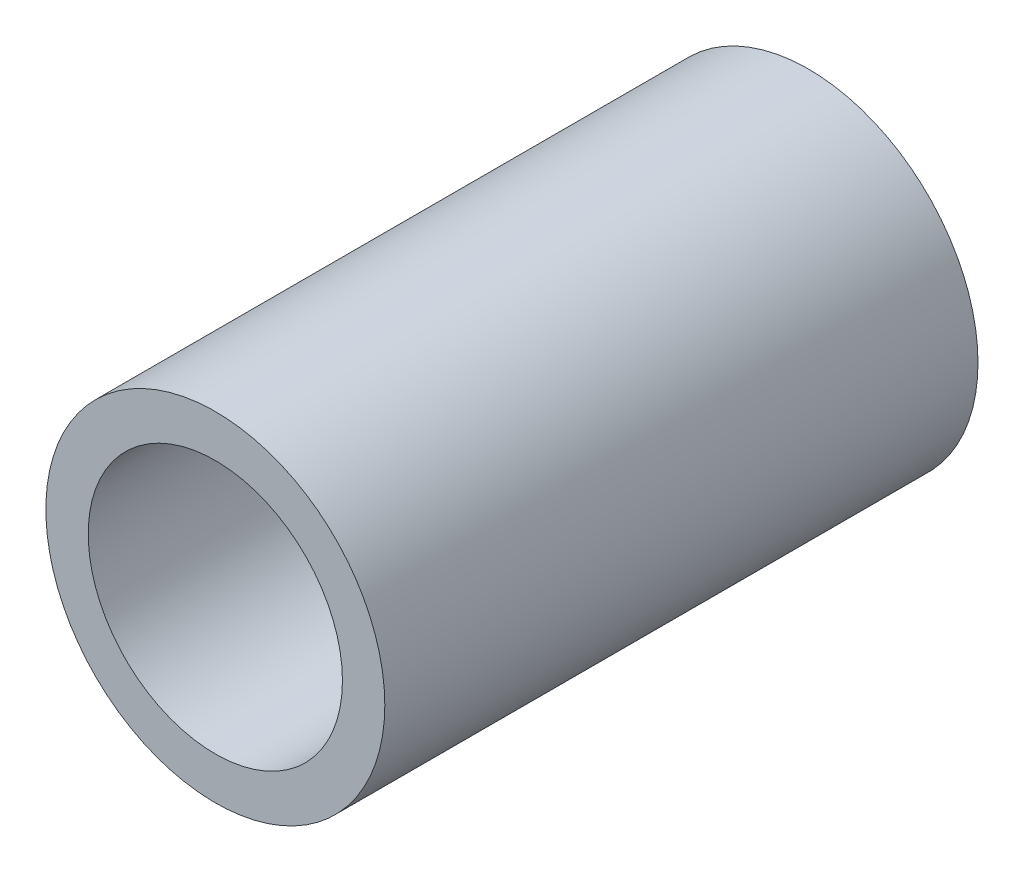
ISO-10303-21;
HEADER;
FILE_DESCRIPTION(('STEP AP214'),'2;1');
FILE_NAME('part.step','',(''),(''),'','','');
FILE_SCHEMA(('AUTOMOTIVE_DESIGN { 1 0 10303 214 1 1 1 1 }'));
ENDSEC;
DATA;
#1=APPLICATION_CONTEXT('core data for automotive mechanical design processes');
#2=APPLICATION_PROTOCOL_DEFINITION('international standard','automotive_design',2000,#1);
#3=PRODUCT_CONTEXT('',#1,'mechanical');
#4=PRODUCT('Part','Part','',(#3));
#5=PRODUCT_RELATED_PRODUCT_CATEGORY('part','',(#4));
#6=PRODUCT_DEFINITION_FORMATION('','',#4);
#7=PRODUCT_DEFINITION_CONTEXT('part definition',#1,'design');
#8=PRODUCT_DEFINITION('design','',#6,#7);
#9=PRODUCT_DEFINITION_SHAPE('','',#8);
#10=(LENGTH_UNIT() NAMED_UNIT(*) SI_UNIT(.MILLI.,.METRE.));
#11=(NAMED_UNIT(*) PLANE_ANGLE_UNIT() SI_UNIT($,.RADIAN.));
#12=(NAMED_UNIT(*) SI_UNIT($,.STERADIAN.) SOLID_ANGLE_UNIT());
#13=UNCERTAINTY_MEASURE_WITH_UNIT(LENGTH_MEASURE(1.E-05),#10,'distance_accuracy_value','');
#14=(GEOMETRIC_REPRESENTATION_CONTEXT(3) GLOBAL_UNCERTAINTY_ASSIGNED_CONTEXT((#13)) GLOBAL_UNIT_ASSIGNED_CONTEXT((#10,
#11,#12)) REPRESENTATION_CONTEXT('',''));
#15=CARTESIAN_POINT('',(0.,0.,0.));
#16=DIRECTION('',(0.,0.,1.));
#17=DIRECTION('',(1.,0.,0.));
#18=AXIS2_PLACEMENT_3D('',#15,#16,#17);
#19=CARTESIAN_POINT('',(0.,0.,11.1125));
#20=DIRECTION('',(0.,0.,1.));
#21=DIRECTION('',(1.,0.,0.));
#22=AXIS2_PLACEMENT_3D('',#19,#20,#21);
#23=PLANE('',#22);
#24=CARTESIAN_POINT('',(0.,0.,11.1125));
#25=DIRECTION('',(0.,0.,1.));
#26=DIRECTION('',(1.,0.,0.));
#27=AXIS2_PLACEMENT_3D('',#24,#25,#26);
#28=CIRCLE('',#27,6.35);
#29=CARTESIAN_POINT('',(6.35,0.,11.1125));
#30=VERTEX_POINT('',#29);
#31=EDGE_CURVE('E10',#30,#30,#28,.T.);
#32=ORIENTED_EDGE('',*,*,#31,.T.);
#33=EDGE_LOOP('',(#32));
#34=FACE_BOUND('',#33,.T.);
#35=CARTESIAN_POINT('',(0.,0.,11.1125));
#36=DIRECTION('',(0.,0.,1.));
#37=DIRECTION('',(1.,0.,0.));
#38=AXIS2_PLACEMENT_3D('',#35,#36,#37);
#39=CIRCLE('',#38,4.7625);
#40=CARTESIAN_POINT('',(4.7625,0.,11.1125));
#41=VERTEX_POINT('',#40);
#42=EDGE_CURVE('E41',#41,#41,#39,.T.);
#43=ORIENTED_EDGE('',*,*,#42,.F.);
#44=EDGE_LOOP('',(#43));
#45=FACE_BOUND('',#44,.T.);
#46=ADVANCED_FACE('F30',(#34,#45),#23,.T.);
#47=CARTESIAN_POINT('',(0.,0.,-11.1125));
#48=DIRECTION('',(0.,0.,1.));
#49=DIRECTION('',(1.,0.,0.));
#50=AXIS2_PLACEMENT_3D('',#47,#48,#49);
#51=PLANE('',#50);
#52=CARTESIAN_POINT('',(0.,0.,-11.1125));
#53=DIRECTION('',(0.,0.,1.));
#54=DIRECTION('',(1.,0.,0.));
#55=AXIS2_PLACEMENT_3D('',#52,#53,#54);
#56=CIRCLE('',#55,6.35);
#57=CARTESIAN_POINT('',(6.35,0.,-11.1125));
#58=VERTEX_POINT('',#57);
#59=EDGE_CURVE('E34',#58,#58,#56,.T.);
#60=ORIENTED_EDGE('',*,*,#59,.F.);
#61=EDGE_LOOP('',(#60));
#62=FACE_BOUND('',#61,.T.);
#63=CARTESIAN_POINT('',(0.,0.,-11.1125));
#64=DIRECTION('',(0.,0.,1.));
#65=DIRECTION('',(1.,0.,0.));
#66=AXIS2_PLACEMENT_3D('',#63,#64,#65);
#67=CIRCLE('',#66,4.7625);
#68=CARTESIAN_POINT('',(4.7625,0.,-11.1125));
#69=VERTEX_POINT('',#68);
#70=EDGE_CURVE('E43',#69,#69,#67,.T.);
#71=ORIENTED_EDGE('',*,*,#70,.T.);
#72=EDGE_LOOP('',(#71));
#73=FACE_BOUND('',#72,.T.);
#74=ADVANCED_FACE('F53',(#62,#73),#51,.F.);
#75=CARTESIAN_POINT('',(0.,0.,11.1125));
#76=DIRECTION('',(0.,0.,-1.));
#77=DIRECTION('',(-1.,0.,0.));
#78=AXIS2_PLACEMENT_3D('',#75,#76,#77);
#79=CYLINDRICAL_SURFACE('',#78,6.35);
#80=ORIENTED_EDGE('',*,*,#31,.F.);
#81=EDGE_LOOP('',(#80));
#82=FACE_BOUND('',#81,.T.);
#83=ORIENTED_EDGE('',*,*,#59,.T.);
#84=EDGE_LOOP('',(#83));
#85=FACE_BOUND('',#84,.T.);
#86=ADVANCED_FACE('F32',(#82,#85),#79,.T.);
#87=CARTESIAN_POINT('',(0.,0.,11.1125));
#88=DIRECTION('',(0.,0.,-1.));
#89=DIRECTION('',(-1.,0.,0.));
#90=AXIS2_PLACEMENT_3D('',#87,#88,#89);
#91=CYLINDRICAL_SURFACE('',#90,4.7625);
#92=ORIENTED_EDGE('',*,*,#42,.T.);
#93=EDGE_LOOP('',(#92));
#94=FACE_BOUND('',#93,.T.);
#95=ORIENTED_EDGE('',*,*,#70,.F.);
#96=EDGE_LOOP('',(#95));
#97=FACE_BOUND('',#96,.T.);
#98=ADVANCED_FACE('F49',(#94,#97),#91,.F.);
#99=CLOSED_SHELL('',(#46,#74,#86,#98));
#100=MANIFOLD_SOLID_BREP('B2',#99);
#101=ADVANCED_BREP_SHAPE_REPRESENTATION('',(#18,#100),#14);
#102=SHAPE_DEFINITION_REPRESENTATION(#9,#101);
ENDSEC;
END-ISO-10303-21;
